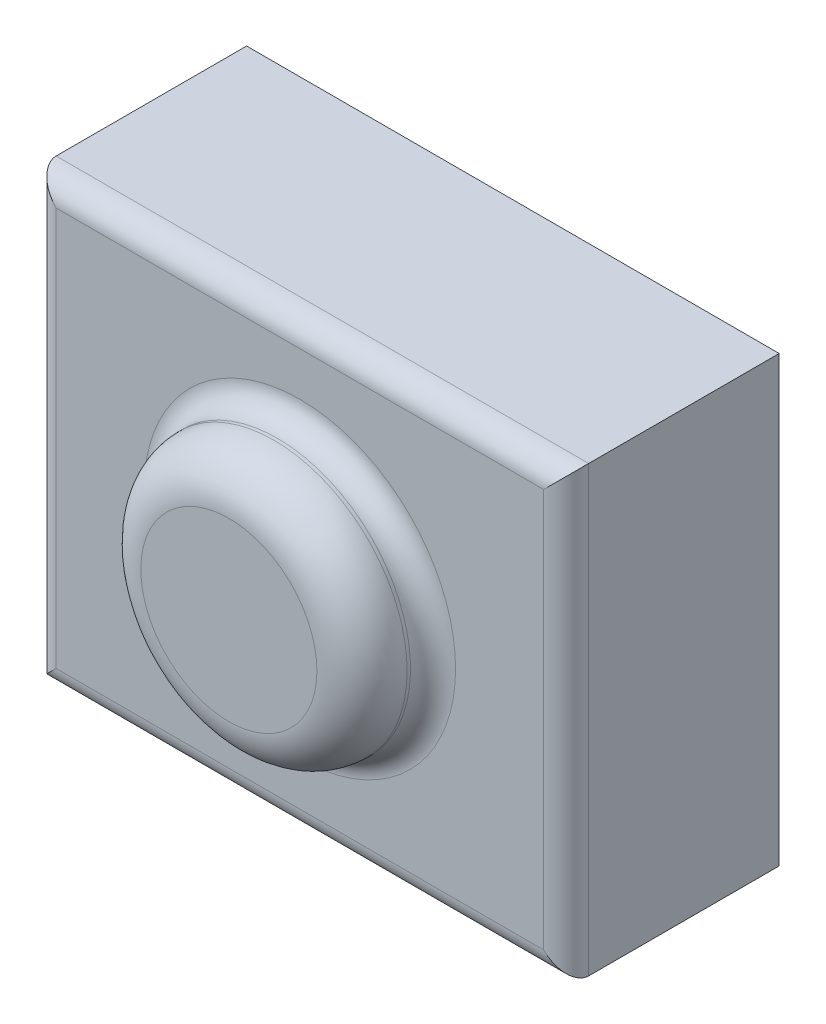
ISO-10303-21;
HEADER;
FILE_DESCRIPTION(('STEP AP214'),'2;1');
FILE_NAME('part.step','',(''),(''),'','','');
FILE_SCHEMA(('AUTOMOTIVE_DESIGN { 1 0 10303 214 1 1 1 1 }'));
ENDSEC;
DATA;
#1=APPLICATION_CONTEXT('core data for automotive mechanical design processes');
#2=APPLICATION_PROTOCOL_DEFINITION('international standard','automotive_design',2000,#1);
#3=PRODUCT_CONTEXT('',#1,'mechanical');
#4=PRODUCT('Part','Part','',(#3));
#5=PRODUCT_RELATED_PRODUCT_CATEGORY('part','',(#4));
#6=PRODUCT_DEFINITION_FORMATION('','',#4);
#7=PRODUCT_DEFINITION_CONTEXT('part definition',#1,'design');
#8=PRODUCT_DEFINITION('design','',#6,#7);
#9=PRODUCT_DEFINITION_SHAPE('','',#8);
#10=(LENGTH_UNIT() NAMED_UNIT(*) SI_UNIT(.MILLI.,.METRE.));
#11=(NAMED_UNIT(*) PLANE_ANGLE_UNIT() SI_UNIT($,.RADIAN.));
#12=(NAMED_UNIT(*) SI_UNIT($,.STERADIAN.) SOLID_ANGLE_UNIT());
#13=UNCERTAINTY_MEASURE_WITH_UNIT(LENGTH_MEASURE(1.E-05),#10,'distance_accuracy_value','');
#14=(GEOMETRIC_REPRESENTATION_CONTEXT(3) GLOBAL_UNCERTAINTY_ASSIGNED_CONTEXT((#13)) GLOBAL_UNIT_ASSIGNED_CONTEXT((#10,
#11,#12)) REPRESENTATION_CONTEXT('',''));
#15=CARTESIAN_POINT('',(0.,0.,0.));
#16=DIRECTION('',(0.,0.,1.));
#17=DIRECTION('',(1.,0.,0.));
#18=AXIS2_PLACEMENT_3D('',#15,#16,#17);
#19=CARTESIAN_POINT('',(0.,0.,1.2));
#20=DIRECTION('',(0.,0.,-1.));
#21=DIRECTION('',(-1.,0.,0.));
#22=AXIS2_PLACEMENT_3D('',#19,#20,#21);
#23=PLANE('',#22);
#24=CARTESIAN_POINT('',(0.,0.,1.2));
#25=DIRECTION('',(0.,0.,-1.));
#26=DIRECTION('',(-1.,0.,0.));
#27=AXIS2_PLACEMENT_3D('',#24,#25,#26);
#28=CIRCLE('',#27,0.877);
#29=CARTESIAN_POINT('',(-0.877,0.,1.2));
#30=VERTEX_POINT('',#29);
#31=EDGE_CURVE('E136',#30,#30,#28,.T.);
#32=ORIENTED_EDGE('',*,*,#31,.T.);
#33=EDGE_LOOP('',(#32));
#34=FACE_BOUND('',#33,.T.);
#35=DIRECTION('',(0.,-1.,0.));
#36=VECTOR('',#35,1.);
#37=CARTESIAN_POINT('',(-1.373,0.,1.2));
#38=LINE('',#37,#36);
#39=CARTESIAN_POINT('',(-1.373,1.123,1.2));
#40=VERTEX_POINT('',#39);
#41=CARTESIAN_POINT('',(-1.373,-1.123,1.2));
#42=VERTEX_POINT('',#41);
#43=EDGE_CURVE('E131',#40,#42,#38,.T.);
#44=ORIENTED_EDGE('',*,*,#43,.T.);
#45=DIRECTION('',(1.,0.,0.));
#46=VECTOR('',#45,1.);
#47=CARTESIAN_POINT('',(0.,-1.123,1.2));
#48=LINE('',#47,#46);
#49=CARTESIAN_POINT('',(1.373,-1.123,1.2));
#50=VERTEX_POINT('',#49);
#51=EDGE_CURVE('E133',#42,#50,#48,.T.);
#52=ORIENTED_EDGE('',*,*,#51,.T.);
#53=DIRECTION('',(0.,1.,0.));
#54=VECTOR('',#53,1.);
#55=CARTESIAN_POINT('',(1.373,0.,1.2));
#56=LINE('',#55,#54);
#57=CARTESIAN_POINT('',(1.373,1.123,1.2));
#58=VERTEX_POINT('',#57);
#59=EDGE_CURVE('E127',#50,#58,#56,.T.);
#60=ORIENTED_EDGE('',*,*,#59,.T.);
#61=DIRECTION('',(-1.,0.,0.));
#62=VECTOR('',#61,1.);
#63=CARTESIAN_POINT('',(0.,1.123,1.2));
#64=LINE('',#63,#62);
#65=EDGE_CURVE('E129',#58,#40,#64,.T.);
#66=ORIENTED_EDGE('',*,*,#65,.T.);
#67=EDGE_LOOP('',(#44,#52,#60,#66));
#68=FACE_BOUND('',#67,.T.);
#69=ADVANCED_FACE('F33',(#34,#68),#23,.F.);
#70=CARTESIAN_POINT('',(1.5,-1.25,1.2));
#71=DIRECTION('',(-1.,0.,0.));
#72=DIRECTION('',(0.,0.,1.));
#73=AXIS2_PLACEMENT_3D('',#70,#71,#72);
#74=PLANE('',#73);
#75=DIRECTION('',(0.,0.,-1.));
#76=VECTOR('',#75,1.);
#77=CARTESIAN_POINT('',(1.5,1.25,1.2));
#78=LINE('',#77,#76);
#79=CARTESIAN_POINT('',(1.5,1.25,1.073));
#80=VERTEX_POINT('',#79);
#81=CARTESIAN_POINT('',(1.5,1.25,0.));
#82=VERTEX_POINT('',#81);
#83=EDGE_CURVE('E85',#80,#82,#78,.T.);
#84=ORIENTED_EDGE('',*,*,#83,.F.);
#85=DIRECTION('',(0.,1.,0.));
#86=VECTOR('',#85,1.);
#87=CARTESIAN_POINT('',(1.5,-1.25,1.073));
#88=LINE('',#87,#86);
#89=CARTESIAN_POINT('',(1.5,-1.25,1.073));
#90=VERTEX_POINT('',#89);
#91=EDGE_CURVE('E11',#80,#90,#88,.F.);
#92=ORIENTED_EDGE('',*,*,#91,.T.);
#93=DIRECTION('',(0.,0.,-1.));
#94=VECTOR('',#93,1.);
#95=CARTESIAN_POINT('',(1.5,-1.25,1.2));
#96=LINE('',#95,#94);
#97=CARTESIAN_POINT('',(1.5,-1.25,0.));
#98=VERTEX_POINT('',#97);
#99=EDGE_CURVE('E106',#90,#98,#96,.T.);
#100=ORIENTED_EDGE('',*,*,#99,.T.);
#101=DIRECTION('',(0.,1.,0.));
#102=VECTOR('',#101,1.);
#103=CARTESIAN_POINT('',(1.5,-1.25,0.));
#104=LINE('',#103,#102);
#105=EDGE_CURVE('E100',#98,#82,#104,.T.);
#106=ORIENTED_EDGE('',*,*,#105,.T.);
#107=EDGE_LOOP('',(#84,#92,#100,#106));
#108=FACE_BOUND('',#107,.T.);
#109=ADVANCED_FACE('F104',(#108),#74,.F.);
#110=CARTESIAN_POINT('',(-1.5,1.25,1.2));
#111=DIRECTION('',(0.,-1.,0.));
#112=DIRECTION('',(0.,0.,-1.));
#113=AXIS2_PLACEMENT_3D('',#110,#111,#112);
#114=PLANE('',#113);
#115=DIRECTION('',(0.,0.,-1.));
#116=VECTOR('',#115,1.);
#117=CARTESIAN_POINT('',(-1.5,1.25,1.2));
#118=LINE('',#117,#116);
#119=CARTESIAN_POINT('',(-1.5,1.25,1.073));
#120=VERTEX_POINT('',#119);
#121=CARTESIAN_POINT('',(-1.5,1.25,0.));
#122=VERTEX_POINT('',#121);
#123=EDGE_CURVE('E94',#120,#122,#118,.T.);
#124=ORIENTED_EDGE('',*,*,#123,.F.);
#125=DIRECTION('',(-1.,0.,0.));
#126=VECTOR('',#125,1.);
#127=CARTESIAN_POINT('',(-1.5,1.25,1.073));
#128=LINE('',#127,#126);
#129=EDGE_CURVE('E42',#120,#80,#128,.F.);
#130=ORIENTED_EDGE('',*,*,#129,.T.);
#131=ORIENTED_EDGE('',*,*,#83,.T.);
#132=DIRECTION('',(-1.,0.,0.));
#133=VECTOR('',#132,1.);
#134=CARTESIAN_POINT('',(-1.5,1.25,0.));
#135=LINE('',#134,#133);
#136=EDGE_CURVE('E88',#82,#122,#135,.T.);
#137=ORIENTED_EDGE('',*,*,#136,.T.);
#138=EDGE_LOOP('',(#124,#130,#131,#137));
#139=FACE_BOUND('',#138,.T.);
#140=ADVANCED_FACE('F87',(#139),#114,.F.);
#141=CARTESIAN_POINT('',(-1.5,-1.25,1.2));
#142=DIRECTION('',(1.,0.,0.));
#143=DIRECTION('',(0.,0.,-1.));
#144=AXIS2_PLACEMENT_3D('',#141,#142,#143);
#145=PLANE('',#144);
#146=DIRECTION('',(0.,0.,-1.));
#147=VECTOR('',#146,1.);
#148=CARTESIAN_POINT('',(-1.5,-1.25,1.2));
#149=LINE('',#148,#147);
#150=CARTESIAN_POINT('',(-1.5,-1.25,1.073));
#151=VERTEX_POINT('',#150);
#152=CARTESIAN_POINT('',(-1.5,-1.25,0.));
#153=VERTEX_POINT('',#152);
#154=EDGE_CURVE('E116',#151,#153,#149,.T.);
#155=ORIENTED_EDGE('',*,*,#154,.F.);
#156=DIRECTION('',(0.,-1.,0.));
#157=VECTOR('',#156,1.);
#158=CARTESIAN_POINT('',(-1.5,-1.25,1.073));
#159=LINE('',#158,#157);
#160=EDGE_CURVE('E57',#151,#120,#159,.F.);
#161=ORIENTED_EDGE('',*,*,#160,.T.);
#162=ORIENTED_EDGE('',*,*,#123,.T.);
#163=DIRECTION('',(0.,-1.,0.));
#164=VECTOR('',#163,1.);
#165=CARTESIAN_POINT('',(-1.5,-1.25,0.));
#166=LINE('',#165,#164);
#167=EDGE_CURVE('E102',#122,#153,#166,.T.);
#168=ORIENTED_EDGE('',*,*,#167,.T.);
#169=EDGE_LOOP('',(#155,#161,#162,#168));
#170=FACE_BOUND('',#169,.T.);
#171=ADVANCED_FACE('F165',(#170),#145,.F.);
#172=CARTESIAN_POINT('',(-1.5,-1.25,1.2));
#173=DIRECTION('',(0.,1.,0.));
#174=DIRECTION('',(0.,0.,1.));
#175=AXIS2_PLACEMENT_3D('',#172,#173,#174);
#176=PLANE('',#175);
#177=ORIENTED_EDGE('',*,*,#99,.F.);
#178=DIRECTION('',(1.,0.,0.));
#179=VECTOR('',#178,1.);
#180=CARTESIAN_POINT('',(-1.5,-1.25,1.073));
#181=LINE('',#180,#179);
#182=EDGE_CURVE('E139',#90,#151,#181,.F.);
#183=ORIENTED_EDGE('',*,*,#182,.T.);
#184=ORIENTED_EDGE('',*,*,#154,.T.);
#185=DIRECTION('',(1.,0.,0.));
#186=VECTOR('',#185,1.);
#187=CARTESIAN_POINT('',(-1.5,-1.25,0.));
#188=LINE('',#187,#186);
#189=EDGE_CURVE('E113',#153,#98,#188,.T.);
#190=ORIENTED_EDGE('',*,*,#189,.T.);
#191=EDGE_LOOP('',(#177,#183,#184,#190));
#192=FACE_BOUND('',#191,.T.);
#193=ADVANCED_FACE('F164',(#192),#176,.F.);
#194=CARTESIAN_POINT('',(0.,0.,0.));
#195=DIRECTION('',(0.,0.,-1.));
#196=DIRECTION('',(-1.,0.,0.));
#197=AXIS2_PLACEMENT_3D('',#194,#195,#196);
#198=PLANE('',#197);
#199=ORIENTED_EDGE('',*,*,#105,.F.);
#200=ORIENTED_EDGE('',*,*,#189,.F.);
#201=ORIENTED_EDGE('',*,*,#167,.F.);
#202=ORIENTED_EDGE('',*,*,#136,.F.);
#203=EDGE_LOOP('',(#199,#200,#201,#202));
#204=FACE_BOUND('',#203,.T.);
#205=ADVANCED_FACE('F98',(#204),#198,.T.);
#206=CARTESIAN_POINT('',(0.,0.,1.6));
#207=DIRECTION('',(0.,0.,-1.));
#208=DIRECTION('',(-1.,0.,0.));
#209=AXIS2_PLACEMENT_3D('',#206,#207,#208);
#210=CYLINDRICAL_SURFACE('',#209,0.75);
#211=CARTESIAN_POINT('',(0.,0.,1.327));
#212=DIRECTION('',(0.,0.,-1.));
#213=DIRECTION('',(-1.,0.,0.));
#214=AXIS2_PLACEMENT_3D('',#211,#212,#213);
#215=CIRCLE('',#214,0.75);
#216=CARTESIAN_POINT('',(-0.75,0.,1.327));
#217=VERTEX_POINT('',#216);
#218=EDGE_CURVE('E124',#217,#217,#215,.F.);
#219=ORIENTED_EDGE('',*,*,#218,.T.);
#220=EDGE_LOOP('',(#219));
#221=FACE_BOUND('',#220,.T.);
#222=CARTESIAN_POINT('',(0.,0.,1.346));
#223=DIRECTION('',(0.,0.,1.));
#224=DIRECTION('',(1.,0.,0.));
#225=AXIS2_PLACEMENT_3D('',#222,#223,#224);
#226=CIRCLE('',#225,0.75);
#227=CARTESIAN_POINT('',(0.75,0.,1.346));
#228=VERTEX_POINT('',#227);
#229=EDGE_CURVE('E121',#228,#228,#226,.F.);
#230=ORIENTED_EDGE('',*,*,#229,.T.);
#231=EDGE_LOOP('',(#230));
#232=FACE_BOUND('',#231,.T.);
#233=ADVANCED_FACE('F183',(#221,#232),#210,.T.);
#234=CARTESIAN_POINT('',(0.,0.,1.6));
#235=DIRECTION('',(0.,0.,1.));
#236=DIRECTION('',(1.,0.,0.));
#237=AXIS2_PLACEMENT_3D('',#234,#235,#236);
#238=PLANE('',#237);
#239=CARTESIAN_POINT('',(0.,0.,1.6));
#240=DIRECTION('',(0.,0.,1.));
#241=DIRECTION('',(1.,0.,0.));
#242=AXIS2_PLACEMENT_3D('',#239,#240,#241);
#243=CIRCLE('',#242,0.496);
#244=CARTESIAN_POINT('',(0.496,0.,1.6));
#245=VERTEX_POINT('',#244);
#246=EDGE_CURVE('E93',#245,#245,#243,.T.);
#247=ORIENTED_EDGE('',*,*,#246,.T.);
#248=EDGE_LOOP('',(#247));
#249=FACE_BOUND('',#248,.T.);
#250=ADVANCED_FACE('F189',(#249),#238,.T.);
#251=CARTESIAN_POINT('',(0.,0.,1.346));
#252=DIRECTION('',(0.,0.,1.));
#253=DIRECTION('',(1.,0.,0.));
#254=AXIS2_PLACEMENT_3D('',#251,#252,#253);
#255=TOROIDAL_SURFACE('',#254,0.496,0.254);
#256=ORIENTED_EDGE('',*,*,#229,.F.);
#257=EDGE_LOOP('',(#256));
#258=FACE_BOUND('',#257,.T.);
#259=ORIENTED_EDGE('',*,*,#246,.F.);
#260=EDGE_LOOP('',(#259));
#261=FACE_BOUND('',#260,.T.);
#262=ADVANCED_FACE('F194',(#258,#261),#255,.T.);
#263=CARTESIAN_POINT('',(0.,0.,1.327));
#264=DIRECTION('',(0.,0.,-1.));
#265=DIRECTION('',(-1.,0.,0.));
#266=AXIS2_PLACEMENT_3D('',#263,#264,#265);
#267=TOROIDAL_SURFACE('',#266,0.877,0.127);
#268=ORIENTED_EDGE('',*,*,#31,.F.);
#269=EDGE_LOOP('',(#268));
#270=FACE_BOUND('',#269,.T.);
#271=ORIENTED_EDGE('',*,*,#218,.F.);
#272=EDGE_LOOP('',(#271));
#273=FACE_BOUND('',#272,.T.);
#274=ADVANCED_FACE('F202',(#270,#273),#267,.F.);
#275=CARTESIAN_POINT('',(0.,1.123,1.073));
#276=DIRECTION('',(-1.,0.,0.));
#277=DIRECTION('',(0.,0.,1.));
#278=AXIS2_PLACEMENT_3D('',#275,#276,#277);
#279=CYLINDRICAL_SURFACE('',#278,0.127);
#280=CARTESIAN_POINT('',(1.373,1.123,1.073));
#281=DIRECTION('',(-0.707106781186547,0.707106781186547,0.));
#282=DIRECTION('',(0.707106781186547,0.707106781186547,0.));
#283=AXIS2_PLACEMENT_3D('',#280,#281,#282);
#284=ELLIPSE('',#283,0.179605122421383,0.127);
#285=EDGE_CURVE('E110',#80,#58,#284,.F.);
#286=ORIENTED_EDGE('',*,*,#285,.F.);
#287=ORIENTED_EDGE('',*,*,#129,.F.);
#288=CARTESIAN_POINT('',(-1.373,1.123,1.073));
#289=DIRECTION('',(-0.707106781186547,-0.707106781186547,0.));
#290=DIRECTION('',(-0.707106781186547,0.707106781186547,0.));
#291=AXIS2_PLACEMENT_3D('',#288,#289,#290);
#292=ELLIPSE('',#291,0.179605122421383,0.127);
#293=EDGE_CURVE('E37',#40,#120,#292,.T.);
#294=ORIENTED_EDGE('',*,*,#293,.F.);
#295=ORIENTED_EDGE('',*,*,#65,.F.);
#296=EDGE_LOOP('',(#286,#287,#294,#295));
#297=FACE_BOUND('',#296,.T.);
#298=ADVANCED_FACE('F35',(#297),#279,.T.);
#299=CARTESIAN_POINT('',(-1.373,0.,1.073));
#300=DIRECTION('',(0.,-1.,0.));
#301=DIRECTION('',(0.,0.,-1.));
#302=AXIS2_PLACEMENT_3D('',#299,#300,#301);
#303=CYLINDRICAL_SURFACE('',#302,0.127);
#304=ORIENTED_EDGE('',*,*,#293,.T.);
#305=ORIENTED_EDGE('',*,*,#160,.F.);
#306=CARTESIAN_POINT('',(-1.373,-1.123,1.073));
#307=DIRECTION('',(0.707106781186547,-0.707106781186547,0.));
#308=DIRECTION('',(-0.707106781186547,-0.707106781186547,0.));
#309=AXIS2_PLACEMENT_3D('',#306,#307,#308);
#310=ELLIPSE('',#309,0.179605122421383,0.127);
#311=EDGE_CURVE('E146',#42,#151,#310,.T.);
#312=ORIENTED_EDGE('',*,*,#311,.F.);
#313=ORIENTED_EDGE('',*,*,#43,.F.);
#314=EDGE_LOOP('',(#304,#305,#312,#313));
#315=FACE_BOUND('',#314,.T.);
#316=ADVANCED_FACE('F214',(#315),#303,.T.);
#317=CARTESIAN_POINT('',(1.373,0.,1.073));
#318=DIRECTION('',(0.,1.,0.));
#319=DIRECTION('',(0.,0.,1.));
#320=AXIS2_PLACEMENT_3D('',#317,#318,#319);
#321=CYLINDRICAL_SURFACE('',#320,0.127);
#322=ORIENTED_EDGE('',*,*,#285,.T.);
#323=ORIENTED_EDGE('',*,*,#59,.F.);
#324=CARTESIAN_POINT('',(1.373,-1.123,1.073));
#325=DIRECTION('',(0.707106781186547,0.707106781186547,0.));
#326=DIRECTION('',(-0.707106781186547,0.707106781186547,0.));
#327=AXIS2_PLACEMENT_3D('',#324,#325,#326);
#328=ELLIPSE('',#327,0.179605122421383,0.127);
#329=EDGE_CURVE('E144',#90,#50,#328,.F.);
#330=ORIENTED_EDGE('',*,*,#329,.F.);
#331=ORIENTED_EDGE('',*,*,#91,.F.);
#332=EDGE_LOOP('',(#322,#323,#330,#331));
#333=FACE_BOUND('',#332,.T.);
#334=ADVANCED_FACE('F151',(#333),#321,.T.);
#335=CARTESIAN_POINT('',(0.,-1.123,1.073));
#336=DIRECTION('',(1.,0.,0.));
#337=DIRECTION('',(0.,0.,-1.));
#338=AXIS2_PLACEMENT_3D('',#335,#336,#337);
#339=CYLINDRICAL_SURFACE('',#338,0.127);
#340=ORIENTED_EDGE('',*,*,#311,.T.);
#341=ORIENTED_EDGE('',*,*,#182,.F.);
#342=ORIENTED_EDGE('',*,*,#329,.T.);
#343=ORIENTED_EDGE('',*,*,#51,.F.);
#344=EDGE_LOOP('',(#340,#341,#342,#343));
#345=FACE_BOUND('',#344,.T.);
#346=ADVANCED_FACE('F161',(#345),#339,.T.);
#347=CLOSED_SHELL('',(#69,#109,#140,#171,#193,#205,#233,#250,#262,#274,#298,#316,#334,#346));
#348=MANIFOLD_SOLID_BREP('B2',#347);
#349=ADVANCED_BREP_SHAPE_REPRESENTATION('',(#18,#348),#14);
#350=SHAPE_DEFINITION_REPRESENTATION(#9,#349);
ENDSEC;
END-ISO-10303-21;
